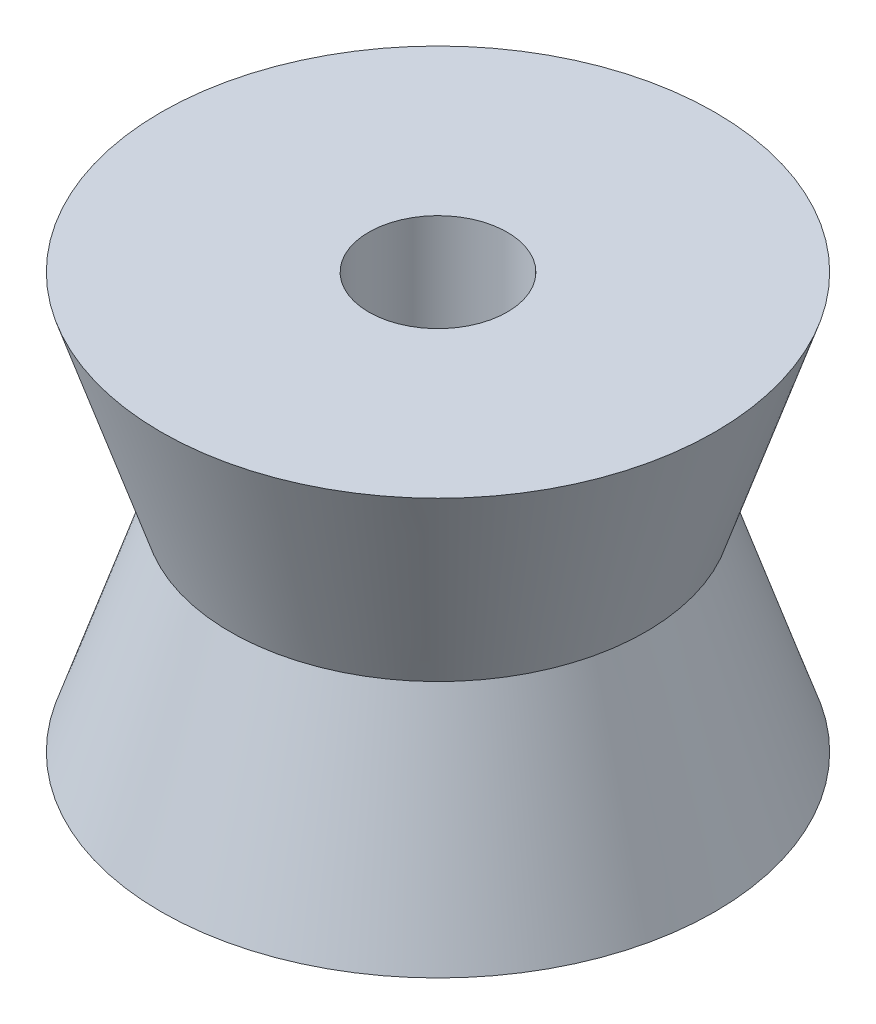
ISO-10303-21;
HEADER;
FILE_DESCRIPTION(('STEP AP214'),'2;1');
FILE_NAME('part.step','',(''),(''),'','','');
FILE_SCHEMA(('AUTOMOTIVE_DESIGN { 1 0 10303 214 1 1 1 1 }'));
ENDSEC;
DATA;
#1=APPLICATION_CONTEXT('core data for automotive mechanical design processes');
#2=APPLICATION_PROTOCOL_DEFINITION('international standard','automotive_design',2000,#1);
#3=PRODUCT_CONTEXT('',#1,'mechanical');
#4=PRODUCT('Part','Part','',(#3));
#5=PRODUCT_RELATED_PRODUCT_CATEGORY('part','',(#4));
#6=PRODUCT_DEFINITION_FORMATION('','',#4);
#7=PRODUCT_DEFINITION_CONTEXT('part definition',#1,'design');
#8=PRODUCT_DEFINITION('design','',#6,#7);
#9=PRODUCT_DEFINITION_SHAPE('','',#8);
#10=(LENGTH_UNIT() NAMED_UNIT(*) SI_UNIT(.MILLI.,.METRE.));
#11=(NAMED_UNIT(*) PLANE_ANGLE_UNIT() SI_UNIT($,.RADIAN.));
#12=(NAMED_UNIT(*) SI_UNIT($,.STERADIAN.) SOLID_ANGLE_UNIT());
#13=UNCERTAINTY_MEASURE_WITH_UNIT(LENGTH_MEASURE(1.E-05),#10,'distance_accuracy_value','');
#14=(GEOMETRIC_REPRESENTATION_CONTEXT(3) GLOBAL_UNCERTAINTY_ASSIGNED_CONTEXT((#13)) GLOBAL_UNIT_ASSIGNED_CONTEXT((#10,
#11,#12)) REPRESENTATION_CONTEXT('',''));
#15=CARTESIAN_POINT('',(0.,0.,0.));
#16=DIRECTION('',(0.,0.,1.));
#17=DIRECTION('',(1.,0.,0.));
#18=AXIS2_PLACEMENT_3D('',#15,#16,#17);
#19=CARTESIAN_POINT('',(0.,30.,0.));
#20=DIRECTION('',(0.,-1.,0.));
#21=DIRECTION('',(0.,0.,-1.));
#22=AXIS2_PLACEMENT_3D('',#19,#20,#21);
#23=PLANE('',#22);
#24=CARTESIAN_POINT('',(0.,30.,0.));
#25=DIRECTION('',(0.,1.,0.));
#26=DIRECTION('',(0.,0.,1.));
#27=AXIS2_PLACEMENT_3D('',#24,#25,#26);
#28=CIRCLE('',#27,5.);
#29=CARTESIAN_POINT('',(0.,30.,5.));
#30=VERTEX_POINT('',#29);
#31=EDGE_CURVE('E48',#30,#30,#28,.T.);
#32=ORIENTED_EDGE('',*,*,#31,.F.);
#33=EDGE_LOOP('',(#32));
#34=FACE_BOUND('',#33,.T.);
#35=CARTESIAN_POINT('',(0.,30.,0.));
#36=DIRECTION('',(0.,-1.,0.));
#37=DIRECTION('',(0.,0.,-1.));
#38=AXIS2_PLACEMENT_3D('',#35,#36,#37);
#39=CIRCLE('',#38,20.);
#40=CARTESIAN_POINT('',(0.,30.,-20.));
#41=VERTEX_POINT('',#40);
#42=EDGE_CURVE('E10',#41,#41,#39,.T.);
#43=ORIENTED_EDGE('',*,*,#42,.F.);
#44=EDGE_LOOP('',(#43));
#45=FACE_BOUND('',#44,.T.);
#46=ADVANCED_FACE('F31',(#34,#45),#23,.F.);
#47=CARTESIAN_POINT('',(0.,30.,0.));
#48=DIRECTION('',(0.,1.,0.));
#49=DIRECTION('',(0.,0.,1.));
#50=AXIS2_PLACEMENT_3D('',#47,#48,#49);
#51=CONICAL_SURFACE('',#50,20.,0.321750554396642);
#52=CARTESIAN_POINT('',(0.,15.,0.));
#53=DIRECTION('',(0.,-1.,0.));
#54=DIRECTION('',(0.,0.,-1.));
#55=AXIS2_PLACEMENT_3D('',#52,#53,#54);
#56=CIRCLE('',#55,15.);
#57=CARTESIAN_POINT('',(0.,15.,-15.));
#58=VERTEX_POINT('',#57);
#59=EDGE_CURVE('E37',#58,#58,#56,.T.);
#60=ORIENTED_EDGE('',*,*,#59,.F.);
#61=EDGE_LOOP('',(#60));
#62=FACE_BOUND('',#61,.T.);
#63=ORIENTED_EDGE('',*,*,#42,.T.);
#64=EDGE_LOOP('',(#63));
#65=FACE_BOUND('',#64,.T.);
#66=ADVANCED_FACE('F65',(#62,#65),#51,.T.);
#67=CARTESIAN_POINT('',(0.,15.,0.));
#68=DIRECTION('',(0.,-1.,0.));
#69=DIRECTION('',(0.,0.,-1.));
#70=AXIS2_PLACEMENT_3D('',#67,#68,#69);
#71=CONICAL_SURFACE('',#70,15.,0.321750554396642);
#72=CARTESIAN_POINT('',(0.,0.,0.));
#73=DIRECTION('',(0.,-1.,0.));
#74=DIRECTION('',(0.,0.,-1.));
#75=AXIS2_PLACEMENT_3D('',#72,#73,#74);
#76=CIRCLE('',#75,20.);
#77=CARTESIAN_POINT('',(0.,0.,-20.));
#78=VERTEX_POINT('',#77);
#79=EDGE_CURVE('E41',#78,#78,#76,.T.);
#80=ORIENTED_EDGE('',*,*,#79,.F.);
#81=EDGE_LOOP('',(#80));
#82=FACE_BOUND('',#81,.T.);
#83=ORIENTED_EDGE('',*,*,#59,.T.);
#84=EDGE_LOOP('',(#83));
#85=FACE_BOUND('',#84,.T.);
#86=ADVANCED_FACE('F69',(#82,#85),#71,.T.);
#87=CARTESIAN_POINT('',(0.,0.,0.));
#88=DIRECTION('',(0.,1.,0.));
#89=DIRECTION('',(0.,0.,1.));
#90=AXIS2_PLACEMENT_3D('',#87,#88,#89);
#91=PLANE('',#90);
#92=CARTESIAN_POINT('',(0.,0.,0.));
#93=DIRECTION('',(0.,1.,0.));
#94=DIRECTION('',(0.,0.,1.));
#95=AXIS2_PLACEMENT_3D('',#92,#93,#94);
#96=CIRCLE('',#95,5.);
#97=CARTESIAN_POINT('',(0.,0.,5.));
#98=VERTEX_POINT('',#97);
#99=EDGE_CURVE('E45',#98,#98,#96,.T.);
#100=ORIENTED_EDGE('',*,*,#99,.T.);
#101=EDGE_LOOP('',(#100));
#102=FACE_BOUND('',#101,.T.);
#103=ORIENTED_EDGE('',*,*,#79,.T.);
#104=EDGE_LOOP('',(#103));
#105=FACE_BOUND('',#104,.T.);
#106=ADVANCED_FACE('F54',(#102,#105),#91,.F.);
#107=CARTESIAN_POINT('',(0.,0.,0.));
#108=DIRECTION('',(0.,1.,0.));
#109=DIRECTION('',(0.,0.,1.));
#110=AXIS2_PLACEMENT_3D('',#107,#108,#109);
#111=CYLINDRICAL_SURFACE('',#110,5.);
#112=CARTESIAN_POINT('',(0.,0.,5.));
#113=CARTESIAN_POINT('',(0.,0.312499999999997,5.));
#114=CARTESIAN_POINT('',(0.,0.624999999999997,5.));
#115=CARTESIAN_POINT('',(0.,1.25,5.));
#116=CARTESIAN_POINT('',(0.,1.5625,5.));
#117=CARTESIAN_POINT('',(0.,2.1875,5.));
#118=CARTESIAN_POINT('',(0.,2.5,5.));
#119=CARTESIAN_POINT('',(0.,3.125,5.));
#120=CARTESIAN_POINT('',(0.,3.4375,5.));
#121=CARTESIAN_POINT('',(0.,4.0625,5.));
#122=CARTESIAN_POINT('',(0.,4.375,5.));
#123=CARTESIAN_POINT('',(0.,5.,5.));
#124=CARTESIAN_POINT('',(0.,5.3125,5.));
#125=CARTESIAN_POINT('',(0.,5.9375,5.));
#126=CARTESIAN_POINT('',(0.,6.25,5.));
#127=CARTESIAN_POINT('',(0.,6.875,5.));
#128=CARTESIAN_POINT('',(0.,7.1875,5.));
#129=CARTESIAN_POINT('',(0.,7.8125,5.));
#130=CARTESIAN_POINT('',(0.,8.125,5.));
#131=CARTESIAN_POINT('',(0.,8.75,5.));
#132=CARTESIAN_POINT('',(0.,9.0625,5.));
#133=CARTESIAN_POINT('',(0.,9.6875,5.));
#134=CARTESIAN_POINT('',(0.,10.,5.));
#135=CARTESIAN_POINT('',(0.,10.625,5.));
#136=CARTESIAN_POINT('',(0.,10.9375,5.));
#137=CARTESIAN_POINT('',(0.,11.5625,5.));
#138=CARTESIAN_POINT('',(0.,11.875,5.));
#139=CARTESIAN_POINT('',(0.,12.5,5.));
#140=CARTESIAN_POINT('',(0.,12.8125,5.));
#141=CARTESIAN_POINT('',(0.,13.4375,5.));
#142=CARTESIAN_POINT('',(0.,13.75,5.));
#143=CARTESIAN_POINT('',(0.,14.375,5.));
#144=CARTESIAN_POINT('',(0.,14.6875,5.));
#145=CARTESIAN_POINT('',(0.,15.3125,5.));
#146=CARTESIAN_POINT('',(0.,15.625,5.));
#147=CARTESIAN_POINT('',(0.,16.25,5.));
#148=CARTESIAN_POINT('',(0.,16.5625,5.));
#149=CARTESIAN_POINT('',(0.,17.1875,5.));
#150=CARTESIAN_POINT('',(0.,17.5,5.));
#151=CARTESIAN_POINT('',(0.,18.125,5.));
#152=CARTESIAN_POINT('',(0.,18.4375,5.));
#153=CARTESIAN_POINT('',(0.,19.0625,5.));
#154=CARTESIAN_POINT('',(0.,19.375,5.));
#155=CARTESIAN_POINT('',(0.,20.,5.));
#156=CARTESIAN_POINT('',(0.,20.3125,5.));
#157=CARTESIAN_POINT('',(0.,20.9375,5.));
#158=CARTESIAN_POINT('',(0.,21.25,5.));
#159=CARTESIAN_POINT('',(0.,21.875,5.));
#160=CARTESIAN_POINT('',(0.,22.1875,5.));
#161=CARTESIAN_POINT('',(0.,22.8125,5.));
#162=CARTESIAN_POINT('',(0.,23.125,5.));
#163=CARTESIAN_POINT('',(0.,23.75,5.));
#164=CARTESIAN_POINT('',(0.,24.0625,5.));
#165=CARTESIAN_POINT('',(0.,24.6875,5.));
#166=CARTESIAN_POINT('',(0.,25.,5.));
#167=CARTESIAN_POINT('',(0.,25.625,5.));
#168=CARTESIAN_POINT('',(0.,25.9375,5.));
#169=CARTESIAN_POINT('',(0.,26.5625,5.));
#170=CARTESIAN_POINT('',(0.,26.875,5.));
#171=CARTESIAN_POINT('',(0.,27.5,5.));
#172=CARTESIAN_POINT('',(0.,27.8125,5.));
#173=CARTESIAN_POINT('',(0.,28.4375,5.));
#174=CARTESIAN_POINT('',(0.,28.75,5.));
#175=CARTESIAN_POINT('',(0.,29.375,5.));
#176=CARTESIAN_POINT('',(0.,29.6875,5.));
#177=CARTESIAN_POINT('',(0.,30.,5.));
#178=B_SPLINE_CURVE_WITH_KNOTS('',3,(#112,#113,#114,#115,#116,#117,#118,#119,#120,#121,#122,
#123,#124,#125,#126,#127,#128,#129,#130,#131,#132,#133,#134,#135,#136,#137,#138,#139,#140,#141,
#142,#143,#144,#145,#146,#147,#148,#149,#150,#151,#152,#153,#154,#155,#156,#157,#158,#159,#160,
#161,#162,#163,#164,#165,#166,#167,#168,#169,#170,#171,#172,#173,#174,#175,#176,#177),
.UNSPECIFIED.,.F.,.F.,(4,2,2,2,2,2,2,2,2,2,2,2,2,2,2,2,2,2,2,2,2,2,2,2,2,2,2,2,2,2,2,2,4),(0.,
0.9375,1.875,2.8125,3.75,4.6875,5.625,6.5625,7.5,8.4375,9.375,10.3125,11.25,12.1875,13.125,
14.0625,15.,15.9375,16.875,17.8125,18.75,19.6875,20.625,21.5625,22.5,23.4375,24.375,25.3125,
26.25,27.1875,28.125,29.0625,30.),.UNSPECIFIED.);
#179=EDGE_CURVE('BSEAM57',#98,#30,#178,.T.);
#180=ORIENTED_EDGE('',*,*,#99,.F.);
#181=ORIENTED_EDGE('',*,*,#31,.T.);
#182=ORIENTED_EDGE('',*,*,#179,.T.);
#183=ORIENTED_EDGE('',*,*,#179,.F.);
#184=EDGE_LOOP('',(#180,#182,#181,#183));
#185=FACE_BOUND('',#184,.T.);
#186=ADVANCED_FACE('F57',(#185),#111,.F.);
#187=CLOSED_SHELL('',(#46,#66,#86,#106,#186));
#188=MANIFOLD_SOLID_BREP('B2',#187);
#189=ADVANCED_BREP_SHAPE_REPRESENTATION('',(#18,#188),#14);
#190=SHAPE_DEFINITION_REPRESENTATION(#9,#189);
ENDSEC;
END-ISO-10303-21;
